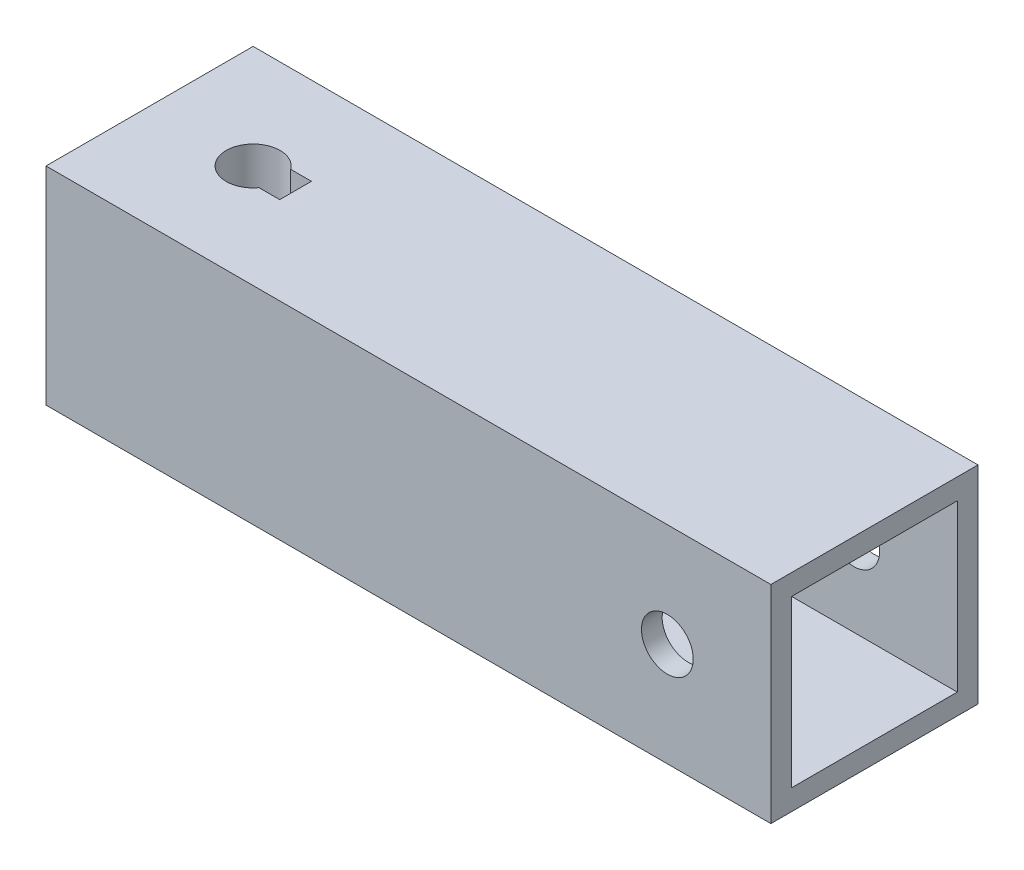
ISO-10303-21;
HEADER;
FILE_DESCRIPTION(('STEP AP214'),'2;1');
FILE_NAME('part.step','',(''),(''),'','','');
FILE_SCHEMA(('AUTOMOTIVE_DESIGN { 1 0 10303 214 1 1 1 1 }'));
ENDSEC;
DATA;
#1=APPLICATION_CONTEXT('core data for automotive mechanical design processes');
#2=APPLICATION_PROTOCOL_DEFINITION('international standard','automotive_design',2000,#1);
#3=PRODUCT_CONTEXT('',#1,'mechanical');
#4=PRODUCT('Part','Part','',(#3));
#5=PRODUCT_RELATED_PRODUCT_CATEGORY('part','',(#4));
#6=PRODUCT_DEFINITION_FORMATION('','',#4);
#7=PRODUCT_DEFINITION_CONTEXT('part definition',#1,'design');
#8=PRODUCT_DEFINITION('design','',#6,#7);
#9=PRODUCT_DEFINITION_SHAPE('','',#8);
#10=(LENGTH_UNIT() NAMED_UNIT(*) SI_UNIT(.MILLI.,.METRE.));
#11=(NAMED_UNIT(*) PLANE_ANGLE_UNIT() SI_UNIT($,.RADIAN.));
#12=(NAMED_UNIT(*) SI_UNIT($,.STERADIAN.) SOLID_ANGLE_UNIT());
#13=UNCERTAINTY_MEASURE_WITH_UNIT(LENGTH_MEASURE(1.E-05),#10,'distance_accuracy_value','');
#14=(GEOMETRIC_REPRESENTATION_CONTEXT(3) GLOBAL_UNCERTAINTY_ASSIGNED_CONTEXT((#13)) GLOBAL_UNIT_ASSIGNED_CONTEXT((#10,
#11,#12)) REPRESENTATION_CONTEXT('',''));
#15=CARTESIAN_POINT('',(0.,0.,0.));
#16=DIRECTION('',(0.,0.,1.));
#17=DIRECTION('',(1.,0.,0.));
#18=AXIS2_PLACEMENT_3D('',#15,#16,#17);
#19=CARTESIAN_POINT('',(50.,20.,-20.));
#20=DIRECTION('',(0.,0.,1.));
#21=DIRECTION('',(1.,0.,0.));
#22=AXIS2_PLACEMENT_3D('',#19,#20,#21);
#23=CYLINDRICAL_SURFACE('',#22,5.);
#24=CARTESIAN_POINT('',(50.,20.,-16.));
#25=DIRECTION('',(0.,0.,-1.));
#26=DIRECTION('',(-1.,0.,0.));
#27=AXIS2_PLACEMENT_3D('',#24,#25,#26);
#28=CIRCLE('',#27,5.);
#29=CARTESIAN_POINT('',(45.,20.,-16.));
#30=VERTEX_POINT('',#29);
#31=EDGE_CURVE('E41',#30,#30,#28,.F.);
#32=ORIENTED_EDGE('',*,*,#31,.T.);
#33=EDGE_LOOP('',(#32));
#34=FACE_BOUND('',#33,.T.);
#35=CARTESIAN_POINT('',(50.,20.,-20.));
#36=DIRECTION('',(0.,0.,1.));
#37=DIRECTION('',(1.,0.,0.));
#38=AXIS2_PLACEMENT_3D('',#35,#36,#37);
#39=CIRCLE('',#38,5.);
#40=CARTESIAN_POINT('',(55.,20.,-20.));
#41=VERTEX_POINT('',#40);
#42=EDGE_CURVE('E187',#41,#41,#39,.T.);
#43=ORIENTED_EDGE('',*,*,#42,.F.);
#44=EDGE_LOOP('',(#43));
#45=FACE_BOUND('',#44,.T.);
#46=ADVANCED_FACE('F37',(#34,#45),#23,.F.);
#47=CARTESIAN_POINT('',(-50.,40.,0.));
#48=DIRECTION('',(0.,-1.,0.));
#49=DIRECTION('',(0.,0.,-1.));
#50=AXIS2_PLACEMENT_3D('',#47,#48,#49);
#51=CYLINDRICAL_SURFACE('',#50,5.2);
#52=CARTESIAN_POINT('',(-50.,40.,0.));
#53=DIRECTION('',(0.,1.,0.));
#54=DIRECTION('',(0.,0.,1.));
#55=AXIS2_PLACEMENT_3D('',#52,#53,#54);
#56=CIRCLE('',#55,5.2);
#57=CARTESIAN_POINT('',(-45.8,40.,-3.06594194335114));
#58=VERTEX_POINT('',#57);
#59=CARTESIAN_POINT('',(-45.8,40.,3.06594194335122));
#60=VERTEX_POINT('',#59);
#61=EDGE_CURVE('E191',#58,#60,#56,.T.);
#62=ORIENTED_EDGE('',*,*,#61,.T.);
#63=DIRECTION('',(0.,-1.,0.));
#64=VECTOR('',#63,1.);
#65=CARTESIAN_POINT('',(-45.8,40.,3.06594194335117));
#66=LINE('',#65,#64);
#67=CARTESIAN_POINT('',(-45.8,0.,3.06594194335122));
#68=VERTEX_POINT('',#67);
#69=EDGE_CURVE('E46',#60,#68,#66,.T.);
#70=ORIENTED_EDGE('',*,*,#69,.T.);
#71=CARTESIAN_POINT('',(-50.,0.,0.));
#72=DIRECTION('',(0.,1.,0.));
#73=DIRECTION('',(0.,0.,1.));
#74=AXIS2_PLACEMENT_3D('',#71,#72,#73);
#75=CIRCLE('',#74,5.2);
#76=CARTESIAN_POINT('',(-45.8,0.,-3.06594194335116));
#77=VERTEX_POINT('',#76);
#78=EDGE_CURVE('E190',#77,#68,#75,.T.);
#79=ORIENTED_EDGE('',*,*,#78,.F.);
#80=DIRECTION('',(0.,-1.,0.));
#81=VECTOR('',#80,1.);
#82=CARTESIAN_POINT('',(-45.7999999999999,40.,-3.06594194335113));
#83=LINE('',#82,#81);
#84=EDGE_CURVE('E226',#77,#58,#83,.F.);
#85=ORIENTED_EDGE('',*,*,#84,.T.);
#86=EDGE_LOOP('',(#62,#70,#79,#85));
#87=FACE_BOUND('',#86,.T.);
#88=ADVANCED_FACE('F252',(#87),#51,.F.);
#89=CARTESIAN_POINT('',(0.,40.,0.));
#90=DIRECTION('',(0.,-1.,0.));
#91=DIRECTION('',(0.,0.,-1.));
#92=AXIS2_PLACEMENT_3D('',#89,#90,#91);
#93=PLANE('',#92);
#94=DIRECTION('',(0.,0.,-1.));
#95=VECTOR('',#94,1.);
#96=CARTESIAN_POINT('',(70.,40.,20.));
#97=LINE('',#96,#95);
#98=CARTESIAN_POINT('',(70.,40.,20.));
#99=VERTEX_POINT('',#98);
#100=CARTESIAN_POINT('',(70.,40.,-20.));
#101=VERTEX_POINT('',#100);
#102=EDGE_CURVE('E197',#99,#101,#97,.T.);
#103=ORIENTED_EDGE('',*,*,#102,.T.);
#104=DIRECTION('',(-1.,0.,0.));
#105=VECTOR('',#104,1.);
#106=CARTESIAN_POINT('',(-70.,40.,-20.));
#107=LINE('',#106,#105);
#108=CARTESIAN_POINT('',(-70.,40.,-20.));
#109=VERTEX_POINT('',#108);
#110=EDGE_CURVE('E200',#101,#109,#107,.T.);
#111=ORIENTED_EDGE('',*,*,#110,.T.);
#112=DIRECTION('',(0.,0.,1.));
#113=VECTOR('',#112,1.);
#114=CARTESIAN_POINT('',(-70.,40.,20.));
#115=LINE('',#114,#113);
#116=CARTESIAN_POINT('',(-70.,40.,20.));
#117=VERTEX_POINT('',#116);
#118=EDGE_CURVE('E203',#109,#117,#115,.T.);
#119=ORIENTED_EDGE('',*,*,#118,.T.);
#120=DIRECTION('',(1.,0.,0.));
#121=VECTOR('',#120,1.);
#122=CARTESIAN_POINT('',(-70.,40.,20.));
#123=LINE('',#122,#121);
#124=EDGE_CURVE('E205',#117,#99,#123,.T.);
#125=ORIENTED_EDGE('',*,*,#124,.T.);
#126=EDGE_LOOP('',(#103,#111,#119,#125));
#127=FACE_BOUND('',#126,.T.);
#128=DIRECTION('',(0.,0.,1.));
#129=VECTOR('',#128,1.);
#130=CARTESIAN_POINT('',(-41.8000000000001,40.,0.));
#131=LINE('',#130,#129);
#132=CARTESIAN_POINT('',(-41.8,40.,-3.06594194335119));
#133=VERTEX_POINT('',#132);
#134=CARTESIAN_POINT('',(-41.8,40.,3.06594194335127));
#135=VERTEX_POINT('',#134);
#136=EDGE_CURVE('E168',#133,#135,#131,.T.);
#137=ORIENTED_EDGE('',*,*,#136,.T.);
#138=DIRECTION('',(1.00000000000001,0.,0.));
#139=VECTOR('',#138,1.);
#140=CARTESIAN_POINT('',(0.,40.,3.06594194335125));
#141=LINE('',#140,#139);
#142=EDGE_CURVE('E172',#60,#135,#141,.T.);
#143=ORIENTED_EDGE('',*,*,#142,.F.);
#144=ORIENTED_EDGE('',*,*,#61,.F.);
#145=DIRECTION('',(1.00000000000001,0.,0.));
#146=VECTOR('',#145,1.);
#147=CARTESIAN_POINT('',(0.,40.,-3.06594194335118));
#148=LINE('',#147,#146);
#149=EDGE_CURVE('E62',#58,#133,#148,.T.);
#150=ORIENTED_EDGE('',*,*,#149,.T.);
#151=EDGE_LOOP('',(#137,#143,#144,#150));
#152=FACE_BOUND('',#151,.T.);
#153=ADVANCED_FACE('F258',(#127,#152),#93,.F.);
#154=CARTESIAN_POINT('',(0.,0.,0.));
#155=DIRECTION('',(0.,-1.,0.));
#156=DIRECTION('',(0.,0.,-1.));
#157=AXIS2_PLACEMENT_3D('',#154,#155,#156);
#158=PLANE('',#157);
#159=DIRECTION('',(-1.,0.,0.));
#160=VECTOR('',#159,1.);
#161=CARTESIAN_POINT('',(0.,0.,3.06594194335125));
#162=LINE('',#161,#160);
#163=CARTESIAN_POINT('',(-41.8,0.,3.06594194335127));
#164=VERTEX_POINT('',#163);
#165=EDGE_CURVE('E182',#164,#68,#162,.T.);
#166=ORIENTED_EDGE('',*,*,#165,.F.);
#167=DIRECTION('',(0.,0.,-1.));
#168=VECTOR('',#167,1.);
#169=CARTESIAN_POINT('',(-41.8000000000001,0.,0.));
#170=LINE('',#169,#168);
#171=CARTESIAN_POINT('',(-41.8,0.,-3.06594194335119));
#172=VERTEX_POINT('',#171);
#173=EDGE_CURVE('E11',#164,#172,#170,.T.);
#174=ORIENTED_EDGE('',*,*,#173,.T.);
#175=DIRECTION('',(-1.,0.,0.));
#176=VECTOR('',#175,1.);
#177=CARTESIAN_POINT('',(0.,0.,-3.06594194335118));
#178=LINE('',#177,#176);
#179=EDGE_CURVE('E178',#172,#77,#178,.T.);
#180=ORIENTED_EDGE('',*,*,#179,.T.);
#181=ORIENTED_EDGE('',*,*,#78,.T.);
#182=EDGE_LOOP('',(#166,#174,#180,#181));
#183=FACE_BOUND('',#182,.T.);
#184=DIRECTION('',(0.,0.,-1.));
#185=VECTOR('',#184,1.);
#186=CARTESIAN_POINT('',(70.,0.,20.));
#187=LINE('',#186,#185);
#188=CARTESIAN_POINT('',(70.,0.,20.));
#189=VERTEX_POINT('',#188);
#190=CARTESIAN_POINT('',(70.,0.,-20.));
#191=VERTEX_POINT('',#190);
#192=EDGE_CURVE('E194',#189,#191,#187,.T.);
#193=ORIENTED_EDGE('',*,*,#192,.F.);
#194=DIRECTION('',(1.,0.,0.));
#195=VECTOR('',#194,1.);
#196=CARTESIAN_POINT('',(-70.,0.,20.));
#197=LINE('',#196,#195);
#198=CARTESIAN_POINT('',(-70.,0.,20.));
#199=VERTEX_POINT('',#198);
#200=EDGE_CURVE('E201',#199,#189,#197,.T.);
#201=ORIENTED_EDGE('',*,*,#200,.F.);
#202=DIRECTION('',(0.,0.,1.));
#203=VECTOR('',#202,1.);
#204=CARTESIAN_POINT('',(-70.,0.,20.));
#205=LINE('',#204,#203);
#206=CARTESIAN_POINT('',(-70.,0.,-20.));
#207=VERTEX_POINT('',#206);
#208=EDGE_CURVE('E212',#207,#199,#205,.T.);
#209=ORIENTED_EDGE('',*,*,#208,.F.);
#210=DIRECTION('',(-1.,0.,0.));
#211=VECTOR('',#210,1.);
#212=CARTESIAN_POINT('',(-70.,0.,-20.));
#213=LINE('',#212,#211);
#214=EDGE_CURVE('E210',#191,#207,#213,.T.);
#215=ORIENTED_EDGE('',*,*,#214,.F.);
#216=EDGE_LOOP('',(#193,#201,#209,#215));
#217=FACE_BOUND('',#216,.T.);
#218=ADVANCED_FACE('F286',(#183,#217),#158,.T.);
#219=CARTESIAN_POINT('',(70.,40.,20.));
#220=DIRECTION('',(-1.,0.,0.));
#221=DIRECTION('',(0.,0.,1.));
#222=AXIS2_PLACEMENT_3D('',#219,#220,#221);
#223=PLANE('',#222);
#224=DIRECTION('',(0.,0.,1.));
#225=VECTOR('',#224,1.);
#226=CARTESIAN_POINT('',(70.,36.,20.));
#227=LINE('',#226,#225);
#228=CARTESIAN_POINT('',(70.,36.,-16.));
#229=VERTEX_POINT('',#228);
#230=CARTESIAN_POINT('',(70.,36.,16.));
#231=VERTEX_POINT('',#230);
#232=EDGE_CURVE('E158',#229,#231,#227,.T.);
#233=ORIENTED_EDGE('',*,*,#232,.F.);
#234=DIRECTION('',(0.,1.,0.));
#235=VECTOR('',#234,1.);
#236=CARTESIAN_POINT('',(70.,40.,-16.));
#237=LINE('',#236,#235);
#238=CARTESIAN_POINT('',(70.,4.,-16.));
#239=VERTEX_POINT('',#238);
#240=EDGE_CURVE('E54',#239,#229,#237,.T.);
#241=ORIENTED_EDGE('',*,*,#240,.F.);
#242=DIRECTION('',(0.,0.,-1.));
#243=VECTOR('',#242,1.);
#244=CARTESIAN_POINT('',(70.,4.,20.));
#245=LINE('',#244,#243);
#246=CARTESIAN_POINT('',(70.,4.,16.));
#247=VERTEX_POINT('',#246);
#248=EDGE_CURVE('E149',#247,#239,#245,.T.);
#249=ORIENTED_EDGE('',*,*,#248,.F.);
#250=DIRECTION('',(0.,-1.,0.));
#251=VECTOR('',#250,1.);
#252=CARTESIAN_POINT('',(70.,40.,16.));
#253=LINE('',#252,#251);
#254=EDGE_CURVE('E152',#231,#247,#253,.T.);
#255=ORIENTED_EDGE('',*,*,#254,.F.);
#256=EDGE_LOOP('',(#233,#241,#249,#255));
#257=FACE_BOUND('',#256,.T.);
#258=ORIENTED_EDGE('',*,*,#192,.T.);
#259=DIRECTION('',(0.,-1.,0.));
#260=VECTOR('',#259,1.);
#261=CARTESIAN_POINT('',(70.,40.,-20.));
#262=LINE('',#261,#260);
#263=EDGE_CURVE('E223',#101,#191,#262,.T.);
#264=ORIENTED_EDGE('',*,*,#263,.F.);
#265=ORIENTED_EDGE('',*,*,#102,.F.);
#266=DIRECTION('',(0.,-1.,0.));
#267=VECTOR('',#266,1.);
#268=CARTESIAN_POINT('',(70.,40.,20.));
#269=LINE('',#268,#267);
#270=EDGE_CURVE('E207',#99,#189,#269,.T.);
#271=ORIENTED_EDGE('',*,*,#270,.T.);
#272=EDGE_LOOP('',(#258,#264,#265,#271));
#273=FACE_BOUND('',#272,.T.);
#274=ADVANCED_FACE('F39',(#257,#273),#223,.F.);
#275=CARTESIAN_POINT('',(-70.,40.,-20.));
#276=DIRECTION('',(0.,0.,1.));
#277=DIRECTION('',(1.,0.,0.));
#278=AXIS2_PLACEMENT_3D('',#275,#276,#277);
#279=PLANE('',#278);
#280=ORIENTED_EDGE('',*,*,#42,.T.);
#281=EDGE_LOOP('',(#280));
#282=FACE_BOUND('',#281,.T.);
#283=ORIENTED_EDGE('',*,*,#214,.T.);
#284=DIRECTION('',(0.,-1.,0.));
#285=VECTOR('',#284,1.);
#286=CARTESIAN_POINT('',(-70.,40.,-20.));
#287=LINE('',#286,#285);
#288=EDGE_CURVE('E220',#109,#207,#287,.T.);
#289=ORIENTED_EDGE('',*,*,#288,.F.);
#290=ORIENTED_EDGE('',*,*,#110,.F.);
#291=ORIENTED_EDGE('',*,*,#263,.T.);
#292=EDGE_LOOP('',(#283,#289,#290,#291));
#293=FACE_BOUND('',#292,.T.);
#294=ADVANCED_FACE('F289',(#282,#293),#279,.F.);
#295=CARTESIAN_POINT('',(-70.,40.,20.));
#296=DIRECTION('',(1.,0.,0.));
#297=DIRECTION('',(0.,0.,-1.));
#298=AXIS2_PLACEMENT_3D('',#295,#296,#297);
#299=PLANE('',#298);
#300=ORIENTED_EDGE('',*,*,#208,.T.);
#301=DIRECTION('',(0.,-1.,0.));
#302=VECTOR('',#301,1.);
#303=CARTESIAN_POINT('',(-70.,40.,20.));
#304=LINE('',#303,#302);
#305=EDGE_CURVE('E217',#117,#199,#304,.T.);
#306=ORIENTED_EDGE('',*,*,#305,.F.);
#307=ORIENTED_EDGE('',*,*,#118,.F.);
#308=ORIENTED_EDGE('',*,*,#288,.T.);
#309=EDGE_LOOP('',(#300,#306,#307,#308));
#310=FACE_BOUND('',#309,.T.);
#311=ADVANCED_FACE('F270',(#310),#299,.F.);
#312=CARTESIAN_POINT('',(-70.,40.,20.));
#313=DIRECTION('',(0.,0.,-1.));
#314=DIRECTION('',(-1.,0.,0.));
#315=AXIS2_PLACEMENT_3D('',#312,#313,#314);
#316=PLANE('',#315);
#317=CARTESIAN_POINT('',(50.,20.,20.));
#318=DIRECTION('',(0.,0.,1.));
#319=DIRECTION('',(1.,0.,0.));
#320=AXIS2_PLACEMENT_3D('',#317,#318,#319);
#321=CIRCLE('',#320,5.);
#322=CARTESIAN_POINT('',(55.,20.,20.));
#323=VERTEX_POINT('',#322);
#324=EDGE_CURVE('E184',#323,#323,#321,.T.);
#325=ORIENTED_EDGE('',*,*,#324,.F.);
#326=EDGE_LOOP('',(#325));
#327=FACE_BOUND('',#326,.T.);
#328=ORIENTED_EDGE('',*,*,#200,.T.);
#329=ORIENTED_EDGE('',*,*,#270,.F.);
#330=ORIENTED_EDGE('',*,*,#124,.F.);
#331=ORIENTED_EDGE('',*,*,#305,.T.);
#332=EDGE_LOOP('',(#328,#329,#330,#331));
#333=FACE_BOUND('',#332,.T.);
#334=ADVANCED_FACE('F264',(#327,#333),#316,.F.);
#335=CARTESIAN_POINT('',(50.,20.,16.));
#336=DIRECTION('',(0.,0.,1.));
#337=DIRECTION('',(0.,-1.,0.));
#338=AXIS2_PLACEMENT_3D('',#335,#336,#337);
#339=CIRCLE('',#338,5.);
#340=CARTESIAN_POINT('',(50.,15.,16.));
#341=VERTEX_POINT('',#340);
#342=EDGE_CURVE('E164',#341,#341,#339,.F.);
#343=ORIENTED_EDGE('',*,*,#342,.T.);
#344=EDGE_LOOP('',(#343));
#345=FACE_BOUND('',#344,.T.);
#346=ORIENTED_EDGE('',*,*,#324,.T.);
#347=EDGE_LOOP('',(#346));
#348=FACE_BOUND('',#347,.T.);
#349=ADVANCED_FACE('F254',(#345,#348),#23,.F.);
#350=CARTESIAN_POINT('',(-41.8000000000001,-1.2E-05,0.));
#351=DIRECTION('',(-1.,0.,0.));
#352=DIRECTION('',(0.,0.,1.));
#353=AXIS2_PLACEMENT_3D('',#350,#351,#352);
#354=PLANE('',#353);
#355=DIRECTION('',(0.,1.,0.));
#356=VECTOR('',#355,1.);
#357=CARTESIAN_POINT('',(-41.8,-1.2E-05,3.06594194335127));
#358=LINE('',#357,#356);
#359=EDGE_CURVE('E176',#164,#135,#358,.T.);
#360=ORIENTED_EDGE('',*,*,#359,.T.);
#361=ORIENTED_EDGE('',*,*,#136,.F.);
#362=DIRECTION('',(0.,1.,0.));
#363=VECTOR('',#362,1.);
#364=CARTESIAN_POINT('',(-41.8,-1.2E-05,-3.06594194335119));
#365=LINE('',#364,#363);
#366=EDGE_CURVE('E175',#172,#133,#365,.T.);
#367=ORIENTED_EDGE('',*,*,#366,.F.);
#368=ORIENTED_EDGE('',*,*,#173,.F.);
#369=EDGE_LOOP('',(#360,#361,#367,#368));
#370=FACE_BOUND('',#369,.T.);
#371=ADVANCED_FACE('F263',(#370),#354,.T.);
#372=CARTESIAN_POINT('',(0.,-1.2E-05,3.06594194335125));
#373=DIRECTION('',(0.,0.,1.));
#374=DIRECTION('',(1.,0.,0.));
#375=AXIS2_PLACEMENT_3D('',#372,#373,#374);
#376=PLANE('',#375);
#377=ORIENTED_EDGE('',*,*,#165,.T.);
#378=ORIENTED_EDGE('',*,*,#69,.F.);
#379=ORIENTED_EDGE('',*,*,#142,.T.);
#380=ORIENTED_EDGE('',*,*,#359,.F.);
#381=EDGE_LOOP('',(#377,#378,#379,#380));
#382=FACE_BOUND('',#381,.T.);
#383=ADVANCED_FACE('F247',(#382),#376,.F.);
#384=CARTESIAN_POINT('',(0.,-1.2E-05,-3.06594194335118));
#385=DIRECTION('',(0.,0.,1.));
#386=DIRECTION('',(1.,0.,0.));
#387=AXIS2_PLACEMENT_3D('',#384,#385,#386);
#388=PLANE('',#387);
#389=ORIENTED_EDGE('',*,*,#366,.T.);
#390=ORIENTED_EDGE('',*,*,#149,.F.);
#391=ORIENTED_EDGE('',*,*,#84,.F.);
#392=ORIENTED_EDGE('',*,*,#179,.F.);
#393=EDGE_LOOP('',(#389,#390,#391,#392));
#394=FACE_BOUND('',#393,.T.);
#395=ADVANCED_FACE('F238',(#394),#388,.T.);
#396=CARTESIAN_POINT('',(-9.99999999999998,40.,-16.));
#397=DIRECTION('',(0.,0.,-1.));
#398=DIRECTION('',(-1.,0.,0.));
#399=AXIS2_PLACEMENT_3D('',#396,#397,#398);
#400=PLANE('',#399);
#401=ORIENTED_EDGE('',*,*,#240,.T.);
#402=DIRECTION('',(1.,0.,0.));
#403=VECTOR('',#402,1.);
#404=CARTESIAN_POINT('',(-9.99999999999998,36.,-16.));
#405=LINE('',#404,#403);
#406=CARTESIAN_POINT('',(-9.99999999999998,36.,-16.));
#407=VERTEX_POINT('',#406);
#408=EDGE_CURVE('E126',#407,#229,#405,.T.);
#409=ORIENTED_EDGE('',*,*,#408,.F.);
#410=DIRECTION('',(0.,1.,0.));
#411=VECTOR('',#410,1.);
#412=CARTESIAN_POINT('',(-9.99999999999998,40.,-16.));
#413=LINE('',#412,#411);
#414=CARTESIAN_POINT('',(-9.99999999999998,4.,-16.));
#415=VERTEX_POINT('',#414);
#416=EDGE_CURVE('E131',#415,#407,#413,.T.);
#417=ORIENTED_EDGE('',*,*,#416,.F.);
#418=DIRECTION('',(1.,0.,0.));
#419=VECTOR('',#418,1.);
#420=CARTESIAN_POINT('',(-9.99999999999998,4.,-16.));
#421=LINE('',#420,#419);
#422=EDGE_CURVE('E162',#415,#239,#421,.T.);
#423=ORIENTED_EDGE('',*,*,#422,.T.);
#424=EDGE_LOOP('',(#401,#409,#417,#423));
#425=FACE_BOUND('',#424,.T.);
#426=ORIENTED_EDGE('',*,*,#31,.F.);
#427=EDGE_LOOP('',(#426));
#428=FACE_BOUND('',#427,.T.);
#429=ADVANCED_FACE('F128',(#425,#428),#400,.F.);
#430=CARTESIAN_POINT('',(-9.99999999999998,40.,16.));
#431=DIRECTION('',(0.,0.,1.));
#432=DIRECTION('',(0.,-1.,0.));
#433=AXIS2_PLACEMENT_3D('',#430,#431,#432);
#434=PLANE('',#433);
#435=ORIENTED_EDGE('',*,*,#254,.T.);
#436=DIRECTION('',(1.,0.,0.));
#437=VECTOR('',#436,1.);
#438=CARTESIAN_POINT('',(-9.99999999999998,4.,16.));
#439=LINE('',#438,#437);
#440=CARTESIAN_POINT('',(-9.99999999999998,4.,16.));
#441=VERTEX_POINT('',#440);
#442=EDGE_CURVE('E165',#441,#247,#439,.T.);
#443=ORIENTED_EDGE('',*,*,#442,.F.);
#444=DIRECTION('',(0.,-1.,0.));
#445=VECTOR('',#444,1.);
#446=CARTESIAN_POINT('',(-9.99999999999998,40.,16.));
#447=LINE('',#446,#445);
#448=CARTESIAN_POINT('',(-9.99999999999998,36.,16.));
#449=VERTEX_POINT('',#448);
#450=EDGE_CURVE('E145',#449,#441,#447,.T.);
#451=ORIENTED_EDGE('',*,*,#450,.F.);
#452=DIRECTION('',(1.,0.,0.));
#453=VECTOR('',#452,1.);
#454=CARTESIAN_POINT('',(-9.99999999999998,36.,16.));
#455=LINE('',#454,#453);
#456=EDGE_CURVE('E136',#449,#231,#455,.T.);
#457=ORIENTED_EDGE('',*,*,#456,.T.);
#458=EDGE_LOOP('',(#435,#443,#451,#457));
#459=FACE_BOUND('',#458,.T.);
#460=ORIENTED_EDGE('',*,*,#342,.F.);
#461=EDGE_LOOP('',(#460));
#462=FACE_BOUND('',#461,.T.);
#463=ADVANCED_FACE('F237',(#459,#462),#434,.F.);
#464=CARTESIAN_POINT('',(-9.99999999999998,4.,20.));
#465=DIRECTION('',(0.,-1.,0.));
#466=DIRECTION('',(0.,0.,-1.));
#467=AXIS2_PLACEMENT_3D('',#464,#465,#466);
#468=PLANE('',#467);
#469=ORIENTED_EDGE('',*,*,#248,.T.);
#470=ORIENTED_EDGE('',*,*,#422,.F.);
#471=DIRECTION('',(0.,0.,-1.));
#472=VECTOR('',#471,1.);
#473=CARTESIAN_POINT('',(-9.99999999999998,4.,20.));
#474=LINE('',#473,#472);
#475=EDGE_CURVE('E137',#441,#415,#474,.T.);
#476=ORIENTED_EDGE('',*,*,#475,.F.);
#477=ORIENTED_EDGE('',*,*,#442,.T.);
#478=EDGE_LOOP('',(#469,#470,#476,#477));
#479=FACE_BOUND('',#478,.T.);
#480=ADVANCED_FACE('F244',(#479),#468,.F.);
#481=CARTESIAN_POINT('',(-9.99999999999998,36.,20.));
#482=DIRECTION('',(0.,1.,0.));
#483=DIRECTION('',(0.,0.,1.));
#484=AXIS2_PLACEMENT_3D('',#481,#482,#483);
#485=PLANE('',#484);
#486=ORIENTED_EDGE('',*,*,#232,.T.);
#487=ORIENTED_EDGE('',*,*,#456,.F.);
#488=DIRECTION('',(0.,0.,1.));
#489=VECTOR('',#488,1.);
#490=CARTESIAN_POINT('',(-9.99999999999998,36.,20.));
#491=LINE('',#490,#489);
#492=EDGE_CURVE('E140',#407,#449,#491,.T.);
#493=ORIENTED_EDGE('',*,*,#492,.F.);
#494=ORIENTED_EDGE('',*,*,#408,.T.);
#495=EDGE_LOOP('',(#486,#487,#493,#494));
#496=FACE_BOUND('',#495,.T.);
#497=ADVANCED_FACE('F141',(#496),#485,.F.);
#498=CARTESIAN_POINT('',(-9.99999999999998,0.,0.));
#499=DIRECTION('',(1.,0.,0.));
#500=DIRECTION('',(0.,0.,-1.));
#501=AXIS2_PLACEMENT_3D('',#498,#499,#500);
#502=PLANE('',#501);
#503=ORIENTED_EDGE('',*,*,#416,.T.);
#504=ORIENTED_EDGE('',*,*,#492,.T.);
#505=ORIENTED_EDGE('',*,*,#450,.T.);
#506=ORIENTED_EDGE('',*,*,#475,.T.);
#507=EDGE_LOOP('',(#503,#504,#505,#506));
#508=FACE_BOUND('',#507,.T.);
#509=ADVANCED_FACE('F147',(#508),#502,.T.);
#510=CLOSED_SHELL('',(#46,#88,#153,#218,#274,#294,#311,#334,#349,#371,#383,#395,#429,#463,#480,
#497,#509));
#511=MANIFOLD_SOLID_BREP('B2',#510);
#512=ADVANCED_BREP_SHAPE_REPRESENTATION('',(#18,#511),#14);
#513=SHAPE_DEFINITION_REPRESENTATION(#9,#512);
ENDSEC;
END-ISO-10303-21;
